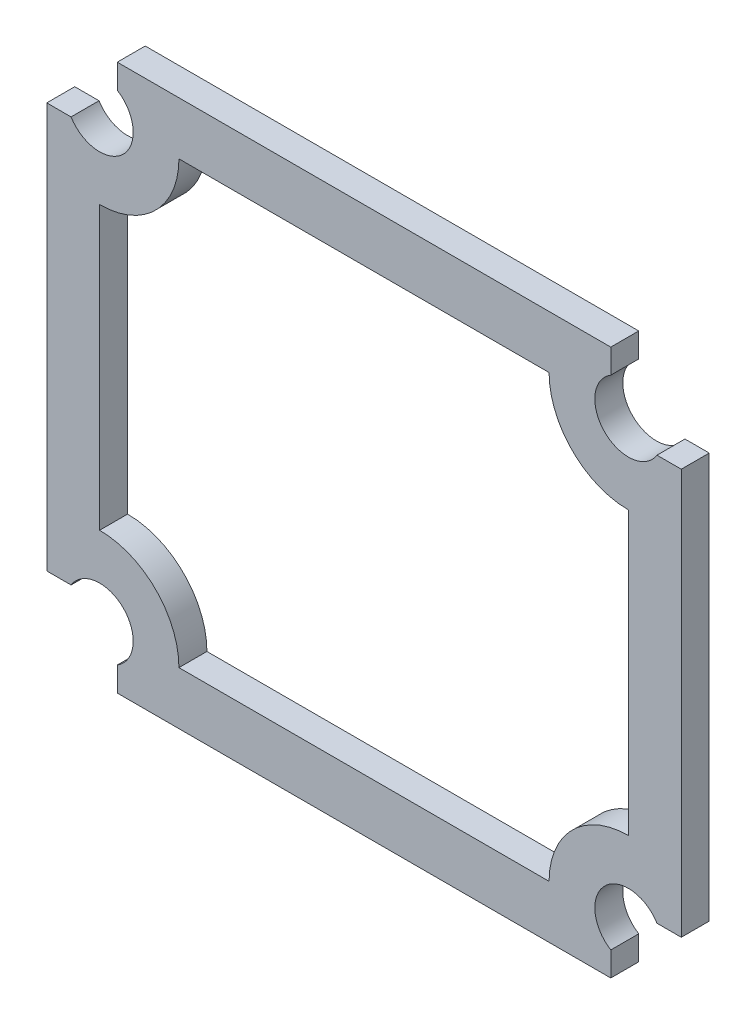
ISO-10303-21;
HEADER;
FILE_DESCRIPTION(('STEP AP214'),'2;1');
FILE_NAME('part.step','',(''),(''),'','','');
FILE_SCHEMA(('AUTOMOTIVE_DESIGN { 1 0 10303 214 1 1 1 1 }'));
ENDSEC;
DATA;
#1=APPLICATION_CONTEXT('core data for automotive mechanical design processes');
#2=APPLICATION_PROTOCOL_DEFINITION('international standard','automotive_design',2000,#1);
#3=PRODUCT_CONTEXT('',#1,'mechanical');
#4=PRODUCT('Part','Part','',(#3));
#5=PRODUCT_RELATED_PRODUCT_CATEGORY('part','',(#4));
#6=PRODUCT_DEFINITION_FORMATION('','',#4);
#7=PRODUCT_DEFINITION_CONTEXT('part definition',#1,'design');
#8=PRODUCT_DEFINITION('design','',#6,#7);
#9=PRODUCT_DEFINITION_SHAPE('','',#8);
#10=(LENGTH_UNIT() NAMED_UNIT(*) SI_UNIT(.MILLI.,.METRE.));
#11=(NAMED_UNIT(*) PLANE_ANGLE_UNIT() SI_UNIT($,.RADIAN.));
#12=(NAMED_UNIT(*) SI_UNIT($,.STERADIAN.) SOLID_ANGLE_UNIT());
#13=UNCERTAINTY_MEASURE_WITH_UNIT(LENGTH_MEASURE(1.E-05),#10,'distance_accuracy_value','');
#14=(GEOMETRIC_REPRESENTATION_CONTEXT(3) GLOBAL_UNCERTAINTY_ASSIGNED_CONTEXT((#13)) GLOBAL_UNIT_ASSIGNED_CONTEXT((#10,
#11,#12)) REPRESENTATION_CONTEXT('',''));
#15=CARTESIAN_POINT('',(0.,0.,0.));
#16=DIRECTION('',(0.,0.,1.));
#17=DIRECTION('',(1.,0.,0.));
#18=AXIS2_PLACEMENT_3D('',#15,#16,#17);
#19=CARTESIAN_POINT('',(-15.,-12.5,1.5875));
#20=DIRECTION('',(0.,0.,-1.));
#21=DIRECTION('',(-1.,0.,0.));
#22=AXIS2_PLACEMENT_3D('',#19,#20,#21);
#23=PLANE('',#22);
#24=DIRECTION('',(1.,0.,0.));
#25=VECTOR('',#24,1.);
#26=CARTESIAN_POINT('',(-18.,-11.5,1.5875));
#27=LINE('',#26,#25);
#28=CARTESIAN_POINT('',(-18.,-11.5,1.5875));
#29=VERTEX_POINT('',#28);
#30=CARTESIAN_POINT('',(-16.6214268407794,-11.5,1.5875));
#31=VERTEX_POINT('',#30);
#32=EDGE_CURVE('E290',#29,#31,#27,.T.);
#33=ORIENTED_EDGE('',*,*,#32,.T.);
#34=CARTESIAN_POINT('',(-15.,-12.5,1.5875));
#35=DIRECTION('',(0.,0.,-1.));
#36=DIRECTION('',(-1.,0.,0.));
#37=AXIS2_PLACEMENT_3D('',#34,#35,#36);
#38=CIRCLE('',#37,1.905);
#39=CARTESIAN_POINT('',(-14.,-14.1214268407794,1.5875));
#40=VERTEX_POINT('',#39);
#41=EDGE_CURVE('E294',#31,#40,#38,.T.);
#42=ORIENTED_EDGE('',*,*,#41,.T.);
#43=DIRECTION('',(0.,-1.,0.));
#44=VECTOR('',#43,1.);
#45=CARTESIAN_POINT('',(-14.,-15.5,1.5875));
#46=LINE('',#45,#44);
#47=CARTESIAN_POINT('',(-14.,-15.5,1.5875));
#48=VERTEX_POINT('',#47);
#49=EDGE_CURVE('E298',#40,#48,#46,.T.);
#50=ORIENTED_EDGE('',*,*,#49,.T.);
#51=DIRECTION('',(1.,0.,0.));
#52=VECTOR('',#51,1.);
#53=CARTESIAN_POINT('',(14.,-15.5,1.5875));
#54=LINE('',#53,#52);
#55=CARTESIAN_POINT('',(14.,-15.5,1.5875));
#56=VERTEX_POINT('',#55);
#57=EDGE_CURVE('E301',#48,#56,#54,.T.);
#58=ORIENTED_EDGE('',*,*,#57,.T.);
#59=DIRECTION('',(0.,1.,0.));
#60=VECTOR('',#59,1.);
#61=CARTESIAN_POINT('',(14.,-15.5,1.5875));
#62=LINE('',#61,#60);
#63=CARTESIAN_POINT('',(14.,-14.1214268407794,1.5875));
#64=VERTEX_POINT('',#63);
#65=EDGE_CURVE('E304',#56,#64,#62,.T.);
#66=ORIENTED_EDGE('',*,*,#65,.T.);
#67=CARTESIAN_POINT('',(15.,-12.5,1.5875));
#68=DIRECTION('',(0.,0.,-1.));
#69=DIRECTION('',(1.,0.,0.));
#70=AXIS2_PLACEMENT_3D('',#67,#68,#69);
#71=CIRCLE('',#70,1.905);
#72=CARTESIAN_POINT('',(16.6214268407794,-11.5,1.5875));
#73=VERTEX_POINT('',#72);
#74=EDGE_CURVE('E307',#64,#73,#71,.T.);
#75=ORIENTED_EDGE('',*,*,#74,.T.);
#76=DIRECTION('',(1.,0.,0.));
#77=VECTOR('',#76,1.);
#78=CARTESIAN_POINT('',(18.,-11.5,1.5875));
#79=LINE('',#78,#77);
#80=CARTESIAN_POINT('',(18.,-11.5,1.5875));
#81=VERTEX_POINT('',#80);
#82=EDGE_CURVE('E310',#73,#81,#79,.T.);
#83=ORIENTED_EDGE('',*,*,#82,.T.);
#84=DIRECTION('',(0.,1.,0.));
#85=VECTOR('',#84,1.);
#86=CARTESIAN_POINT('',(18.,11.5,1.5875));
#87=LINE('',#86,#85);
#88=CARTESIAN_POINT('',(18.,11.5,1.5875));
#89=VERTEX_POINT('',#88);
#90=EDGE_CURVE('E313',#81,#89,#87,.T.);
#91=ORIENTED_EDGE('',*,*,#90,.T.);
#92=DIRECTION('',(-1.,0.,0.));
#93=VECTOR('',#92,1.);
#94=CARTESIAN_POINT('',(18.,11.5,1.5875));
#95=LINE('',#94,#93);
#96=CARTESIAN_POINT('',(16.6214268407794,11.5,1.5875));
#97=VERTEX_POINT('',#96);
#98=EDGE_CURVE('E316',#89,#97,#95,.T.);
#99=ORIENTED_EDGE('',*,*,#98,.T.);
#100=CARTESIAN_POINT('',(15.,12.5,1.5875));
#101=DIRECTION('',(0.,0.,-1.));
#102=DIRECTION('',(-1.,0.,0.));
#103=AXIS2_PLACEMENT_3D('',#100,#101,#102);
#104=CIRCLE('',#103,1.905);
#105=CARTESIAN_POINT('',(14.,14.1214268407794,1.5875));
#106=VERTEX_POINT('',#105);
#107=EDGE_CURVE('E319',#97,#106,#104,.T.);
#108=ORIENTED_EDGE('',*,*,#107,.T.);
#109=DIRECTION('',(0.,1.,0.));
#110=VECTOR('',#109,1.);
#111=CARTESIAN_POINT('',(14.,15.5,1.5875));
#112=LINE('',#111,#110);
#113=CARTESIAN_POINT('',(14.,15.5,1.5875));
#114=VERTEX_POINT('',#113);
#115=EDGE_CURVE('E322',#106,#114,#112,.T.);
#116=ORIENTED_EDGE('',*,*,#115,.T.);
#117=DIRECTION('',(-1.,0.,0.));
#118=VECTOR('',#117,1.);
#119=CARTESIAN_POINT('',(14.,15.5,1.5875));
#120=LINE('',#119,#118);
#121=CARTESIAN_POINT('',(-14.,15.5,1.5875));
#122=VERTEX_POINT('',#121);
#123=EDGE_CURVE('E325',#114,#122,#120,.T.);
#124=ORIENTED_EDGE('',*,*,#123,.T.);
#125=DIRECTION('',(0.,-1.,0.));
#126=VECTOR('',#125,1.);
#127=CARTESIAN_POINT('',(-14.,15.5,1.5875));
#128=LINE('',#127,#126);
#129=CARTESIAN_POINT('',(-14.,14.1214268407794,1.5875));
#130=VERTEX_POINT('',#129);
#131=EDGE_CURVE('E328',#122,#130,#128,.T.);
#132=ORIENTED_EDGE('',*,*,#131,.T.);
#133=CARTESIAN_POINT('',(-15.,12.5,1.5875));
#134=DIRECTION('',(0.,0.,-1.));
#135=DIRECTION('',(1.,0.,0.));
#136=AXIS2_PLACEMENT_3D('',#133,#134,#135);
#137=CIRCLE('',#136,1.905);
#138=CARTESIAN_POINT('',(-16.6214268407794,11.5,1.5875));
#139=VERTEX_POINT('',#138);
#140=EDGE_CURVE('E331',#130,#139,#137,.T.);
#141=ORIENTED_EDGE('',*,*,#140,.T.);
#142=DIRECTION('',(-1.,0.,0.));
#143=VECTOR('',#142,1.);
#144=CARTESIAN_POINT('',(-18.,11.5,1.5875));
#145=LINE('',#144,#143);
#146=CARTESIAN_POINT('',(-18.,11.5,1.5875));
#147=VERTEX_POINT('',#146);
#148=EDGE_CURVE('E334',#139,#147,#145,.T.);
#149=ORIENTED_EDGE('',*,*,#148,.T.);
#150=DIRECTION('',(0.,-1.,0.));
#151=VECTOR('',#150,1.);
#152=CARTESIAN_POINT('',(-18.,11.5,1.5875));
#153=LINE('',#152,#151);
#154=EDGE_CURVE('E337',#147,#29,#153,.T.);
#155=ORIENTED_EDGE('',*,*,#154,.T.);
#156=EDGE_LOOP('',(#33,#42,#50,#58,#66,#75,#83,#91,#99,#108,#116,#124,#132,#141,#149,#155));
#157=FACE_BOUND('',#156,.T.);
#158=CARTESIAN_POINT('',(-15.,-12.5,1.5875));
#159=DIRECTION('',(0.,0.,-1.));
#160=DIRECTION('',(1.,0.,0.));
#161=AXIS2_PLACEMENT_3D('',#158,#159,#160);
#162=CIRCLE('',#161,4.5);
#163=CARTESIAN_POINT('',(-15.,-8.,1.5875));
#164=VERTEX_POINT('',#163);
#165=CARTESIAN_POINT('',(-10.5,-12.5,1.5875));
#166=VERTEX_POINT('',#165);
#167=EDGE_CURVE('E201',#164,#166,#162,.T.);
#168=ORIENTED_EDGE('',*,*,#167,.F.);
#169=DIRECTION('',(0.,-1.,0.));
#170=VECTOR('',#169,1.);
#171=CARTESIAN_POINT('',(-15.,7.99999999999999,1.5875));
#172=LINE('',#171,#170);
#173=CARTESIAN_POINT('',(-15.,7.99999999999999,1.5875));
#174=VERTEX_POINT('',#173);
#175=EDGE_CURVE('E242',#174,#164,#172,.T.);
#176=ORIENTED_EDGE('',*,*,#175,.F.);
#177=CARTESIAN_POINT('',(-15.,12.5,1.5875));
#178=DIRECTION('',(0.,0.,-1.));
#179=DIRECTION('',(-1.,0.,0.));
#180=AXIS2_PLACEMENT_3D('',#177,#178,#179);
#181=CIRCLE('',#180,4.5);
#182=CARTESIAN_POINT('',(-10.5,12.5,1.5875));
#183=VERTEX_POINT('',#182);
#184=EDGE_CURVE('E239',#183,#174,#181,.T.);
#185=ORIENTED_EDGE('',*,*,#184,.F.);
#186=DIRECTION('',(-1.,0.,0.));
#187=VECTOR('',#186,1.);
#188=CARTESIAN_POINT('',(10.5,12.5,1.5875));
#189=LINE('',#188,#187);
#190=CARTESIAN_POINT('',(10.5,12.5,1.5875));
#191=VERTEX_POINT('',#190);
#192=EDGE_CURVE('E236',#191,#183,#189,.T.);
#193=ORIENTED_EDGE('',*,*,#192,.F.);
#194=CARTESIAN_POINT('',(15.,12.5,1.5875));
#195=DIRECTION('',(0.,0.,-1.));
#196=DIRECTION('',(1.,0.,0.));
#197=AXIS2_PLACEMENT_3D('',#194,#195,#196);
#198=CIRCLE('',#197,4.5);
#199=CARTESIAN_POINT('',(15.,8.,1.5875));
#200=VERTEX_POINT('',#199);
#201=EDGE_CURVE('E233',#200,#191,#198,.T.);
#202=ORIENTED_EDGE('',*,*,#201,.F.);
#203=DIRECTION('',(0.,1.,0.));
#204=VECTOR('',#203,1.);
#205=CARTESIAN_POINT('',(15.,8.,1.5875));
#206=LINE('',#205,#204);
#207=CARTESIAN_POINT('',(15.,-8.00000000000001,1.5875));
#208=VERTEX_POINT('',#207);
#209=EDGE_CURVE('E228',#208,#200,#206,.T.);
#210=ORIENTED_EDGE('',*,*,#209,.F.);
#211=CARTESIAN_POINT('',(15.,-12.5,1.5875));
#212=DIRECTION('',(0.,0.,-1.));
#213=DIRECTION('',(-1.,0.,0.));
#214=AXIS2_PLACEMENT_3D('',#211,#212,#213);
#215=CIRCLE('',#214,4.5);
#216=CARTESIAN_POINT('',(10.5,-12.5,1.5875));
#217=VERTEX_POINT('',#216);
#218=EDGE_CURVE('E224',#217,#208,#215,.T.);
#219=ORIENTED_EDGE('',*,*,#218,.F.);
#220=DIRECTION('',(1.,0.,0.));
#221=VECTOR('',#220,1.);
#222=CARTESIAN_POINT('',(10.5,-12.5,1.5875));
#223=LINE('',#222,#221);
#224=EDGE_CURVE('E210',#166,#217,#223,.T.);
#225=ORIENTED_EDGE('',*,*,#224,.F.);
#226=EDGE_LOOP('',(#168,#176,#185,#193,#202,#210,#219,#225));
#227=FACE_BOUND('',#226,.T.);
#228=ADVANCED_FACE('F39',(#157,#227),#23,.F.);
#229=CARTESIAN_POINT('',(-15.,-12.5,0.));
#230=DIRECTION('',(0.,0.,-1.));
#231=DIRECTION('',(-1.,0.,0.));
#232=AXIS2_PLACEMENT_3D('',#229,#230,#231);
#233=PLANE('',#232);
#234=DIRECTION('',(1.,0.,0.));
#235=VECTOR('',#234,1.);
#236=CARTESIAN_POINT('',(-18.,-11.5,0.));
#237=LINE('',#236,#235);
#238=CARTESIAN_POINT('',(-18.,-11.5,0.));
#239=VERTEX_POINT('',#238);
#240=CARTESIAN_POINT('',(-16.6214268407794,-11.5,0.));
#241=VERTEX_POINT('',#240);
#242=EDGE_CURVE('E219',#239,#241,#237,.T.);
#243=ORIENTED_EDGE('',*,*,#242,.F.);
#244=DIRECTION('',(0.,-1.,0.));
#245=VECTOR('',#244,1.);
#246=CARTESIAN_POINT('',(-18.,11.5,0.));
#247=LINE('',#246,#245);
#248=CARTESIAN_POINT('',(-18.,11.5,0.));
#249=VERTEX_POINT('',#248);
#250=EDGE_CURVE('E295',#249,#239,#247,.T.);
#251=ORIENTED_EDGE('',*,*,#250,.F.);
#252=DIRECTION('',(-1.,0.,0.));
#253=VECTOR('',#252,1.);
#254=CARTESIAN_POINT('',(-18.,11.5,0.));
#255=LINE('',#254,#253);
#256=CARTESIAN_POINT('',(-16.6214268407794,11.5,0.));
#257=VERTEX_POINT('',#256);
#258=EDGE_CURVE('E383',#257,#249,#255,.T.);
#259=ORIENTED_EDGE('',*,*,#258,.F.);
#260=CARTESIAN_POINT('',(-15.,12.5,0.));
#261=DIRECTION('',(0.,0.,-1.));
#262=DIRECTION('',(1.,0.,0.));
#263=AXIS2_PLACEMENT_3D('',#260,#261,#262);
#264=CIRCLE('',#263,1.905);
#265=CARTESIAN_POINT('',(-14.,14.1214268407794,0.));
#266=VERTEX_POINT('',#265);
#267=EDGE_CURVE('E380',#266,#257,#264,.T.);
#268=ORIENTED_EDGE('',*,*,#267,.F.);
#269=DIRECTION('',(0.,-1.,0.));
#270=VECTOR('',#269,1.);
#271=CARTESIAN_POINT('',(-14.,15.5,0.));
#272=LINE('',#271,#270);
#273=CARTESIAN_POINT('',(-14.,15.5,0.));
#274=VERTEX_POINT('',#273);
#275=EDGE_CURVE('E377',#274,#266,#272,.T.);
#276=ORIENTED_EDGE('',*,*,#275,.F.);
#277=DIRECTION('',(-1.,0.,0.));
#278=VECTOR('',#277,1.);
#279=CARTESIAN_POINT('',(14.,15.5,0.));
#280=LINE('',#279,#278);
#281=CARTESIAN_POINT('',(14.,15.5,0.));
#282=VERTEX_POINT('',#281);
#283=EDGE_CURVE('E374',#282,#274,#280,.T.);
#284=ORIENTED_EDGE('',*,*,#283,.F.);
#285=DIRECTION('',(0.,1.,0.));
#286=VECTOR('',#285,1.);
#287=CARTESIAN_POINT('',(14.,15.5,0.));
#288=LINE('',#287,#286);
#289=CARTESIAN_POINT('',(14.,14.1214268407794,0.));
#290=VERTEX_POINT('',#289);
#291=EDGE_CURVE('E371',#290,#282,#288,.T.);
#292=ORIENTED_EDGE('',*,*,#291,.F.);
#293=CARTESIAN_POINT('',(15.,12.5,0.));
#294=DIRECTION('',(0.,0.,-1.));
#295=DIRECTION('',(-1.,0.,0.));
#296=AXIS2_PLACEMENT_3D('',#293,#294,#295);
#297=CIRCLE('',#296,1.905);
#298=CARTESIAN_POINT('',(16.6214268407794,11.5,0.));
#299=VERTEX_POINT('',#298);
#300=EDGE_CURVE('E368',#299,#290,#297,.T.);
#301=ORIENTED_EDGE('',*,*,#300,.F.);
#302=DIRECTION('',(-1.,0.,0.));
#303=VECTOR('',#302,1.);
#304=CARTESIAN_POINT('',(18.,11.5,0.));
#305=LINE('',#304,#303);
#306=CARTESIAN_POINT('',(18.,11.5,0.));
#307=VERTEX_POINT('',#306);
#308=EDGE_CURVE('E365',#307,#299,#305,.T.);
#309=ORIENTED_EDGE('',*,*,#308,.F.);
#310=DIRECTION('',(0.,1.,0.));
#311=VECTOR('',#310,1.);
#312=CARTESIAN_POINT('',(18.,11.5,0.));
#313=LINE('',#312,#311);
#314=CARTESIAN_POINT('',(18.,-11.5,0.));
#315=VERTEX_POINT('',#314);
#316=EDGE_CURVE('E362',#315,#307,#313,.T.);
#317=ORIENTED_EDGE('',*,*,#316,.F.);
#318=DIRECTION('',(1.,0.,0.));
#319=VECTOR('',#318,1.);
#320=CARTESIAN_POINT('',(18.,-11.5,0.));
#321=LINE('',#320,#319);
#322=CARTESIAN_POINT('',(16.6214268407794,-11.5,0.));
#323=VERTEX_POINT('',#322);
#324=EDGE_CURVE('E359',#323,#315,#321,.T.);
#325=ORIENTED_EDGE('',*,*,#324,.F.);
#326=CARTESIAN_POINT('',(15.,-12.5,0.));
#327=DIRECTION('',(0.,0.,-1.));
#328=DIRECTION('',(1.,0.,0.));
#329=AXIS2_PLACEMENT_3D('',#326,#327,#328);
#330=CIRCLE('',#329,1.905);
#331=CARTESIAN_POINT('',(14.,-14.1214268407794,0.));
#332=VERTEX_POINT('',#331);
#333=EDGE_CURVE('E356',#332,#323,#330,.T.);
#334=ORIENTED_EDGE('',*,*,#333,.F.);
#335=DIRECTION('',(0.,1.,0.));
#336=VECTOR('',#335,1.);
#337=CARTESIAN_POINT('',(14.,-15.5,0.));
#338=LINE('',#337,#336);
#339=CARTESIAN_POINT('',(14.,-15.5,0.));
#340=VERTEX_POINT('',#339);
#341=EDGE_CURVE('E353',#340,#332,#338,.T.);
#342=ORIENTED_EDGE('',*,*,#341,.F.);
#343=DIRECTION('',(1.,0.,0.));
#344=VECTOR('',#343,1.);
#345=CARTESIAN_POINT('',(14.,-15.5,0.));
#346=LINE('',#345,#344);
#347=CARTESIAN_POINT('',(-14.,-15.5,0.));
#348=VERTEX_POINT('',#347);
#349=EDGE_CURVE('E350',#348,#340,#346,.T.);
#350=ORIENTED_EDGE('',*,*,#349,.F.);
#351=DIRECTION('',(0.,-1.,0.));
#352=VECTOR('',#351,1.);
#353=CARTESIAN_POINT('',(-14.,-15.5,0.));
#354=LINE('',#353,#352);
#355=CARTESIAN_POINT('',(-14.,-14.1214268407794,0.));
#356=VERTEX_POINT('',#355);
#357=EDGE_CURVE('E347',#356,#348,#354,.T.);
#358=ORIENTED_EDGE('',*,*,#357,.F.);
#359=CARTESIAN_POINT('',(-15.,-12.5,0.));
#360=DIRECTION('',(0.,0.,-1.));
#361=DIRECTION('',(-1.,0.,0.));
#362=AXIS2_PLACEMENT_3D('',#359,#360,#361);
#363=CIRCLE('',#362,1.905);
#364=EDGE_CURVE('E344',#241,#356,#363,.T.);
#365=ORIENTED_EDGE('',*,*,#364,.F.);
#366=EDGE_LOOP('',(#243,#251,#259,#268,#276,#284,#292,#301,#309,#317,#325,#334,#342,#350,#358,#365));
#367=FACE_BOUND('',#366,.T.);
#368=DIRECTION('',(0.,-1.,0.));
#369=VECTOR('',#368,1.);
#370=CARTESIAN_POINT('',(-15.,7.99999999999999,0.));
#371=LINE('',#370,#369);
#372=CARTESIAN_POINT('',(-15.,8.,0.));
#373=VERTEX_POINT('',#372);
#374=CARTESIAN_POINT('',(-15.,-8.,0.));
#375=VERTEX_POINT('',#374);
#376=EDGE_CURVE('E211',#373,#375,#371,.T.);
#377=ORIENTED_EDGE('',*,*,#376,.T.);
#378=CARTESIAN_POINT('',(-15.,-12.5,0.));
#379=DIRECTION('',(0.,0.,-1.));
#380=DIRECTION('',(1.,0.,0.));
#381=AXIS2_PLACEMENT_3D('',#378,#379,#380);
#382=CIRCLE('',#381,4.5);
#383=CARTESIAN_POINT('',(-10.5,-12.5,0.));
#384=VERTEX_POINT('',#383);
#385=EDGE_CURVE('E63',#375,#384,#382,.T.);
#386=ORIENTED_EDGE('',*,*,#385,.T.);
#387=DIRECTION('',(1.,0.,0.));
#388=VECTOR('',#387,1.);
#389=CARTESIAN_POINT('',(10.5,-12.5,0.));
#390=LINE('',#389,#388);
#391=CARTESIAN_POINT('',(10.5,-12.5,0.));
#392=VERTEX_POINT('',#391);
#393=EDGE_CURVE('E217',#384,#392,#390,.T.);
#394=ORIENTED_EDGE('',*,*,#393,.T.);
#395=CARTESIAN_POINT('',(15.,-12.5,0.));
#396=DIRECTION('',(0.,0.,-1.));
#397=DIRECTION('',(-1.,0.,0.));
#398=AXIS2_PLACEMENT_3D('',#395,#396,#397);
#399=CIRCLE('',#398,4.5);
#400=CARTESIAN_POINT('',(15.,-8.00000000000001,0.));
#401=VERTEX_POINT('',#400);
#402=EDGE_CURVE('E249',#392,#401,#399,.T.);
#403=ORIENTED_EDGE('',*,*,#402,.T.);
#404=DIRECTION('',(0.,1.,0.));
#405=VECTOR('',#404,1.);
#406=CARTESIAN_POINT('',(15.,8.,0.));
#407=LINE('',#406,#405);
#408=CARTESIAN_POINT('',(15.,8.,0.));
#409=VERTEX_POINT('',#408);
#410=EDGE_CURVE('E253',#401,#409,#407,.T.);
#411=ORIENTED_EDGE('',*,*,#410,.T.);
#412=CARTESIAN_POINT('',(15.,12.5,0.));
#413=DIRECTION('',(0.,0.,-1.));
#414=DIRECTION('',(1.,0.,0.));
#415=AXIS2_PLACEMENT_3D('',#412,#413,#414);
#416=CIRCLE('',#415,4.5);
#417=CARTESIAN_POINT('',(10.5,12.5,0.));
#418=VERTEX_POINT('',#417);
#419=EDGE_CURVE('E257',#409,#418,#416,.T.);
#420=ORIENTED_EDGE('',*,*,#419,.T.);
#421=DIRECTION('',(-1.,0.,0.));
#422=VECTOR('',#421,1.);
#423=CARTESIAN_POINT('',(10.5,12.5,0.));
#424=LINE('',#423,#422);
#425=CARTESIAN_POINT('',(-10.5,12.5,0.));
#426=VERTEX_POINT('',#425);
#427=EDGE_CURVE('E261',#418,#426,#424,.T.);
#428=ORIENTED_EDGE('',*,*,#427,.T.);
#429=CARTESIAN_POINT('',(-15.,12.5,0.));
#430=DIRECTION('',(0.,0.,-1.));
#431=DIRECTION('',(-1.,0.,0.));
#432=AXIS2_PLACEMENT_3D('',#429,#430,#431);
#433=CIRCLE('',#432,4.5);
#434=EDGE_CURVE('E265',#426,#373,#433,.T.);
#435=ORIENTED_EDGE('',*,*,#434,.T.);
#436=EDGE_LOOP('',(#377,#386,#394,#403,#411,#420,#428,#435));
#437=FACE_BOUND('',#436,.T.);
#438=ADVANCED_FACE('F454',(#367,#437),#233,.T.);
#439=CARTESIAN_POINT('',(-18.,-11.5,1.5875));
#440=DIRECTION('',(0.,1.,0.));
#441=DIRECTION('',(0.,0.,1.));
#442=AXIS2_PLACEMENT_3D('',#439,#440,#441);
#443=PLANE('',#442);
#444=ORIENTED_EDGE('',*,*,#242,.T.);
#445=DIRECTION('',(0.,0.,-1.));
#446=VECTOR('',#445,1.);
#447=CARTESIAN_POINT('',(-16.6214268407794,-11.5,1.5875));
#448=LINE('',#447,#446);
#449=EDGE_CURVE('E11',#31,#241,#448,.T.);
#450=ORIENTED_EDGE('',*,*,#449,.F.);
#451=ORIENTED_EDGE('',*,*,#32,.F.);
#452=DIRECTION('',(0.,0.,-1.));
#453=VECTOR('',#452,1.);
#454=CARTESIAN_POINT('',(-18.,-11.5,1.5875));
#455=LINE('',#454,#453);
#456=EDGE_CURVE('E340',#29,#239,#455,.T.);
#457=ORIENTED_EDGE('',*,*,#456,.T.);
#458=EDGE_LOOP('',(#444,#450,#451,#457));
#459=FACE_BOUND('',#458,.T.);
#460=ADVANCED_FACE('F41',(#459),#443,.F.);
#461=CARTESIAN_POINT('',(-15.,-12.5,1.5875));
#462=DIRECTION('',(0.,0.,-1.));
#463=DIRECTION('',(-1.,0.,0.));
#464=AXIS2_PLACEMENT_3D('',#461,#462,#463);
#465=CYLINDRICAL_SURFACE('',#464,1.905);
#466=ORIENTED_EDGE('',*,*,#364,.T.);
#467=DIRECTION('',(0.,0.,-1.));
#468=VECTOR('',#467,1.);
#469=CARTESIAN_POINT('',(-14.,-14.1214268407794,1.5875));
#470=LINE('',#469,#468);
#471=EDGE_CURVE('E48',#40,#356,#470,.T.);
#472=ORIENTED_EDGE('',*,*,#471,.F.);
#473=ORIENTED_EDGE('',*,*,#41,.F.);
#474=ORIENTED_EDGE('',*,*,#449,.T.);
#475=EDGE_LOOP('',(#466,#472,#473,#474));
#476=FACE_BOUND('',#475,.T.);
#477=ADVANCED_FACE('F471',(#476),#465,.F.);
#478=CARTESIAN_POINT('',(-14.,-15.5,1.5875));
#479=DIRECTION('',(1.,0.,0.));
#480=DIRECTION('',(0.,0.,-1.));
#481=AXIS2_PLACEMENT_3D('',#478,#479,#480);
#482=PLANE('',#481);
#483=ORIENTED_EDGE('',*,*,#357,.T.);
#484=DIRECTION('',(0.,0.,-1.));
#485=VECTOR('',#484,1.);
#486=CARTESIAN_POINT('',(-14.,-15.5,1.5875));
#487=LINE('',#486,#485);
#488=EDGE_CURVE('E439',#48,#348,#487,.T.);
#489=ORIENTED_EDGE('',*,*,#488,.F.);
#490=ORIENTED_EDGE('',*,*,#49,.F.);
#491=ORIENTED_EDGE('',*,*,#471,.T.);
#492=EDGE_LOOP('',(#483,#489,#490,#491));
#493=FACE_BOUND('',#492,.T.);
#494=ADVANCED_FACE('F448',(#493),#482,.F.);
#495=CARTESIAN_POINT('',(14.,-15.5,1.5875));
#496=DIRECTION('',(0.,1.,0.));
#497=DIRECTION('',(0.,0.,1.));
#498=AXIS2_PLACEMENT_3D('',#495,#496,#497);
#499=PLANE('',#498);
#500=ORIENTED_EDGE('',*,*,#349,.T.);
#501=DIRECTION('',(0.,0.,-1.));
#502=VECTOR('',#501,1.);
#503=CARTESIAN_POINT('',(14.,-15.5,1.5875));
#504=LINE('',#503,#502);
#505=EDGE_CURVE('E435',#56,#340,#504,.T.);
#506=ORIENTED_EDGE('',*,*,#505,.F.);
#507=ORIENTED_EDGE('',*,*,#57,.F.);
#508=ORIENTED_EDGE('',*,*,#488,.T.);
#509=EDGE_LOOP('',(#500,#506,#507,#508));
#510=FACE_BOUND('',#509,.T.);
#511=ADVANCED_FACE('F460',(#510),#499,.F.);
#512=CARTESIAN_POINT('',(14.,-15.5,1.5875));
#513=DIRECTION('',(-1.,0.,0.));
#514=DIRECTION('',(0.,-1.,0.));
#515=AXIS2_PLACEMENT_3D('',#512,#513,#514);
#516=PLANE('',#515);
#517=ORIENTED_EDGE('',*,*,#341,.T.);
#518=DIRECTION('',(0.,0.,-1.));
#519=VECTOR('',#518,1.);
#520=CARTESIAN_POINT('',(14.,-14.1214268407794,1.5875));
#521=LINE('',#520,#519);
#522=EDGE_CURVE('E431',#64,#332,#521,.T.);
#523=ORIENTED_EDGE('',*,*,#522,.F.);
#524=ORIENTED_EDGE('',*,*,#65,.F.);
#525=ORIENTED_EDGE('',*,*,#505,.T.);
#526=EDGE_LOOP('',(#517,#523,#524,#525));
#527=FACE_BOUND('',#526,.T.);
#528=ADVANCED_FACE('F464',(#527),#516,.F.);
#529=CARTESIAN_POINT('',(15.,-12.5,1.5875));
#530=DIRECTION('',(0.,0.,-1.));
#531=DIRECTION('',(-1.,0.,0.));
#532=AXIS2_PLACEMENT_3D('',#529,#530,#531);
#533=CYLINDRICAL_SURFACE('',#532,1.905);
#534=ORIENTED_EDGE('',*,*,#333,.T.);
#535=DIRECTION('',(0.,0.,-1.));
#536=VECTOR('',#535,1.);
#537=CARTESIAN_POINT('',(16.6214268407794,-11.5,1.5875));
#538=LINE('',#537,#536);
#539=EDGE_CURVE('E427',#73,#323,#538,.T.);
#540=ORIENTED_EDGE('',*,*,#539,.F.);
#541=ORIENTED_EDGE('',*,*,#74,.F.);
#542=ORIENTED_EDGE('',*,*,#522,.T.);
#543=EDGE_LOOP('',(#534,#540,#541,#542));
#544=FACE_BOUND('',#543,.T.);
#545=ADVANCED_FACE('F524',(#544),#533,.F.);
#546=CARTESIAN_POINT('',(18.,-11.5,1.5875));
#547=DIRECTION('',(0.,1.,0.));
#548=DIRECTION('',(-1.,0.,0.));
#549=AXIS2_PLACEMENT_3D('',#546,#547,#548);
#550=PLANE('',#549);
#551=ORIENTED_EDGE('',*,*,#324,.T.);
#552=DIRECTION('',(0.,0.,-1.));
#553=VECTOR('',#552,1.);
#554=CARTESIAN_POINT('',(18.,-11.5,1.5875));
#555=LINE('',#554,#553);
#556=EDGE_CURVE('E423',#81,#315,#555,.T.);
#557=ORIENTED_EDGE('',*,*,#556,.F.);
#558=ORIENTED_EDGE('',*,*,#82,.F.);
#559=ORIENTED_EDGE('',*,*,#539,.T.);
#560=EDGE_LOOP('',(#551,#557,#558,#559));
#561=FACE_BOUND('',#560,.T.);
#562=ADVANCED_FACE('F521',(#561),#550,.F.);
#563=CARTESIAN_POINT('',(18.,11.5,1.5875));
#564=DIRECTION('',(-1.,0.,0.));
#565=DIRECTION('',(0.,0.,1.));
#566=AXIS2_PLACEMENT_3D('',#563,#564,#565);
#567=PLANE('',#566);
#568=ORIENTED_EDGE('',*,*,#316,.T.);
#569=DIRECTION('',(0.,0.,-1.));
#570=VECTOR('',#569,1.);
#571=CARTESIAN_POINT('',(18.,11.5,1.5875));
#572=LINE('',#571,#570);
#573=EDGE_CURVE('E419',#89,#307,#572,.T.);
#574=ORIENTED_EDGE('',*,*,#573,.F.);
#575=ORIENTED_EDGE('',*,*,#90,.F.);
#576=ORIENTED_EDGE('',*,*,#556,.T.);
#577=EDGE_LOOP('',(#568,#574,#575,#576));
#578=FACE_BOUND('',#577,.T.);
#579=ADVANCED_FACE('F517',(#578),#567,.F.);
#580=CARTESIAN_POINT('',(18.,11.5,1.5875));
#581=DIRECTION('',(0.,-1.,0.));
#582=DIRECTION('',(0.,0.,-1.));
#583=AXIS2_PLACEMENT_3D('',#580,#581,#582);
#584=PLANE('',#583);
#585=ORIENTED_EDGE('',*,*,#308,.T.);
#586=DIRECTION('',(0.,0.,-1.));
#587=VECTOR('',#586,1.);
#588=CARTESIAN_POINT('',(16.6214268407794,11.5,1.5875));
#589=LINE('',#588,#587);
#590=EDGE_CURVE('E415',#97,#299,#589,.T.);
#591=ORIENTED_EDGE('',*,*,#590,.F.);
#592=ORIENTED_EDGE('',*,*,#98,.F.);
#593=ORIENTED_EDGE('',*,*,#573,.T.);
#594=EDGE_LOOP('',(#585,#591,#592,#593));
#595=FACE_BOUND('',#594,.T.);
#596=ADVANCED_FACE('F513',(#595),#584,.F.);
#597=CARTESIAN_POINT('',(15.,12.5,1.5875));
#598=DIRECTION('',(0.,0.,-1.));
#599=DIRECTION('',(-1.,0.,0.));
#600=AXIS2_PLACEMENT_3D('',#597,#598,#599);
#601=CYLINDRICAL_SURFACE('',#600,1.905);
#602=ORIENTED_EDGE('',*,*,#300,.T.);
#603=DIRECTION('',(0.,0.,-1.));
#604=VECTOR('',#603,1.);
#605=CARTESIAN_POINT('',(14.,14.1214268407794,1.5875));
#606=LINE('',#605,#604);
#607=EDGE_CURVE('E411',#106,#290,#606,.T.);
#608=ORIENTED_EDGE('',*,*,#607,.F.);
#609=ORIENTED_EDGE('',*,*,#107,.F.);
#610=ORIENTED_EDGE('',*,*,#590,.T.);
#611=EDGE_LOOP('',(#602,#608,#609,#610));
#612=FACE_BOUND('',#611,.T.);
#613=ADVANCED_FACE('F508',(#612),#601,.F.);
#614=CARTESIAN_POINT('',(14.,15.5,1.5875));
#615=DIRECTION('',(-1.,0.,0.));
#616=DIRECTION('',(0.,-1.,0.));
#617=AXIS2_PLACEMENT_3D('',#614,#615,#616);
#618=PLANE('',#617);
#619=ORIENTED_EDGE('',*,*,#291,.T.);
#620=DIRECTION('',(0.,0.,-1.));
#621=VECTOR('',#620,1.);
#622=CARTESIAN_POINT('',(14.,15.5,1.5875));
#623=LINE('',#622,#621);
#624=EDGE_CURVE('E407',#114,#282,#623,.T.);
#625=ORIENTED_EDGE('',*,*,#624,.F.);
#626=ORIENTED_EDGE('',*,*,#115,.F.);
#627=ORIENTED_EDGE('',*,*,#607,.T.);
#628=EDGE_LOOP('',(#619,#625,#626,#627));
#629=FACE_BOUND('',#628,.T.);
#630=ADVANCED_FACE('F502',(#629),#618,.F.);
#631=CARTESIAN_POINT('',(14.,15.5,1.5875));
#632=DIRECTION('',(0.,-1.,0.));
#633=DIRECTION('',(0.,0.,-1.));
#634=AXIS2_PLACEMENT_3D('',#631,#632,#633);
#635=PLANE('',#634);
#636=ORIENTED_EDGE('',*,*,#283,.T.);
#637=DIRECTION('',(0.,0.,-1.));
#638=VECTOR('',#637,1.);
#639=CARTESIAN_POINT('',(-14.,15.5,1.5875));
#640=LINE('',#639,#638);
#641=EDGE_CURVE('E403',#122,#274,#640,.T.);
#642=ORIENTED_EDGE('',*,*,#641,.F.);
#643=ORIENTED_EDGE('',*,*,#123,.F.);
#644=ORIENTED_EDGE('',*,*,#624,.T.);
#645=EDGE_LOOP('',(#636,#642,#643,#644));
#646=FACE_BOUND('',#645,.T.);
#647=ADVANCED_FACE('F498',(#646),#635,.F.);
#648=CARTESIAN_POINT('',(-14.,15.5,1.5875));
#649=DIRECTION('',(1.,0.,0.));
#650=DIRECTION('',(0.,1.,0.));
#651=AXIS2_PLACEMENT_3D('',#648,#649,#650);
#652=PLANE('',#651);
#653=ORIENTED_EDGE('',*,*,#275,.T.);
#654=DIRECTION('',(0.,0.,-1.));
#655=VECTOR('',#654,1.);
#656=CARTESIAN_POINT('',(-14.,14.1214268407794,1.5875));
#657=LINE('',#656,#655);
#658=EDGE_CURVE('E399',#130,#266,#657,.T.);
#659=ORIENTED_EDGE('',*,*,#658,.F.);
#660=ORIENTED_EDGE('',*,*,#131,.F.);
#661=ORIENTED_EDGE('',*,*,#641,.T.);
#662=EDGE_LOOP('',(#653,#659,#660,#661));
#663=FACE_BOUND('',#662,.T.);
#664=ADVANCED_FACE('F493',(#663),#652,.F.);
#665=CARTESIAN_POINT('',(-15.,12.5,1.5875));
#666=DIRECTION('',(0.,0.,-1.));
#667=DIRECTION('',(-1.,0.,0.));
#668=AXIS2_PLACEMENT_3D('',#665,#666,#667);
#669=CYLINDRICAL_SURFACE('',#668,1.905);
#670=ORIENTED_EDGE('',*,*,#267,.T.);
#671=DIRECTION('',(0.,0.,-1.));
#672=VECTOR('',#671,1.);
#673=CARTESIAN_POINT('',(-16.6214268407794,11.5,1.5875));
#674=LINE('',#673,#672);
#675=EDGE_CURVE('E395',#139,#257,#674,.T.);
#676=ORIENTED_EDGE('',*,*,#675,.F.);
#677=ORIENTED_EDGE('',*,*,#140,.F.);
#678=ORIENTED_EDGE('',*,*,#658,.T.);
#679=EDGE_LOOP('',(#670,#676,#677,#678));
#680=FACE_BOUND('',#679,.T.);
#681=ADVANCED_FACE('F487',(#680),#669,.F.);
#682=CARTESIAN_POINT('',(-18.,11.5,1.5875));
#683=DIRECTION('',(0.,-1.,0.));
#684=DIRECTION('',(1.,0.,0.));
#685=AXIS2_PLACEMENT_3D('',#682,#683,#684);
#686=PLANE('',#685);
#687=ORIENTED_EDGE('',*,*,#258,.T.);
#688=DIRECTION('',(0.,0.,-1.));
#689=VECTOR('',#688,1.);
#690=CARTESIAN_POINT('',(-18.,11.5,1.5875));
#691=LINE('',#690,#689);
#692=EDGE_CURVE('E391',#147,#249,#691,.T.);
#693=ORIENTED_EDGE('',*,*,#692,.F.);
#694=ORIENTED_EDGE('',*,*,#148,.F.);
#695=ORIENTED_EDGE('',*,*,#675,.T.);
#696=EDGE_LOOP('',(#687,#693,#694,#695));
#697=FACE_BOUND('',#696,.T.);
#698=ADVANCED_FACE('F483',(#697),#686,.F.);
#699=CARTESIAN_POINT('',(-18.,11.5,1.5875));
#700=DIRECTION('',(1.,0.,0.));
#701=DIRECTION('',(0.,0.,-1.));
#702=AXIS2_PLACEMENT_3D('',#699,#700,#701);
#703=PLANE('',#702);
#704=ORIENTED_EDGE('',*,*,#250,.T.);
#705=ORIENTED_EDGE('',*,*,#456,.F.);
#706=ORIENTED_EDGE('',*,*,#154,.F.);
#707=ORIENTED_EDGE('',*,*,#692,.T.);
#708=EDGE_LOOP('',(#704,#705,#706,#707));
#709=FACE_BOUND('',#708,.T.);
#710=ADVANCED_FACE('F478',(#709),#703,.F.);
#711=CARTESIAN_POINT('',(-15.,-12.5,1.5875));
#712=DIRECTION('',(0.,0.,-1.));
#713=DIRECTION('',(-1.,0.,0.));
#714=AXIS2_PLACEMENT_3D('',#711,#712,#713);
#715=CYLINDRICAL_SURFACE('',#714,4.5);
#716=ORIENTED_EDGE('',*,*,#385,.F.);
#717=DIRECTION('',(0.,0.,-1.));
#718=VECTOR('',#717,1.);
#719=CARTESIAN_POINT('',(-15.,-8.,1.5875));
#720=LINE('',#719,#718);
#721=EDGE_CURVE('E205',#164,#375,#720,.T.);
#722=ORIENTED_EDGE('',*,*,#721,.F.);
#723=ORIENTED_EDGE('',*,*,#167,.T.);
#724=DIRECTION('',(0.,0.,-1.));
#725=VECTOR('',#724,1.);
#726=CARTESIAN_POINT('',(-10.5,-12.5,1.5875));
#727=LINE('',#726,#725);
#728=EDGE_CURVE('E204',#166,#384,#727,.T.);
#729=ORIENTED_EDGE('',*,*,#728,.T.);
#730=EDGE_LOOP('',(#716,#722,#723,#729));
#731=FACE_BOUND('',#730,.T.);
#732=ADVANCED_FACE('F203',(#731),#715,.T.);
#733=CARTESIAN_POINT('',(10.5,-12.5,1.5875));
#734=DIRECTION('',(0.,1.,0.));
#735=DIRECTION('',(-1.,0.,0.));
#736=AXIS2_PLACEMENT_3D('',#733,#734,#735);
#737=PLANE('',#736);
#738=ORIENTED_EDGE('',*,*,#393,.F.);
#739=ORIENTED_EDGE('',*,*,#728,.F.);
#740=ORIENTED_EDGE('',*,*,#224,.T.);
#741=DIRECTION('',(0.,0.,-1.));
#742=VECTOR('',#741,1.);
#743=CARTESIAN_POINT('',(10.5,-12.5,1.5875));
#744=LINE('',#743,#742);
#745=EDGE_CURVE('E220',#217,#392,#744,.T.);
#746=ORIENTED_EDGE('',*,*,#745,.T.);
#747=EDGE_LOOP('',(#738,#739,#740,#746));
#748=FACE_BOUND('',#747,.T.);
#749=ADVANCED_FACE('F214',(#748),#737,.T.);
#750=CARTESIAN_POINT('',(15.,-12.5,1.5875));
#751=DIRECTION('',(0.,0.,-1.));
#752=DIRECTION('',(-1.,0.,0.));
#753=AXIS2_PLACEMENT_3D('',#750,#751,#752);
#754=CYLINDRICAL_SURFACE('',#753,4.5);
#755=ORIENTED_EDGE('',*,*,#402,.F.);
#756=ORIENTED_EDGE('',*,*,#745,.F.);
#757=ORIENTED_EDGE('',*,*,#218,.T.);
#758=DIRECTION('',(0.,0.,-1.));
#759=VECTOR('',#758,1.);
#760=CARTESIAN_POINT('',(15.,-8.00000000000001,1.5875));
#761=LINE('',#760,#759);
#762=EDGE_CURVE('E285',#208,#401,#761,.T.);
#763=ORIENTED_EDGE('',*,*,#762,.T.);
#764=EDGE_LOOP('',(#755,#756,#757,#763));
#765=FACE_BOUND('',#764,.T.);
#766=ADVANCED_FACE('F606',(#765),#754,.T.);
#767=CARTESIAN_POINT('',(15.,8.,1.5875));
#768=DIRECTION('',(-1.,0.,0.));
#769=DIRECTION('',(0.,-1.,0.));
#770=AXIS2_PLACEMENT_3D('',#767,#768,#769);
#771=PLANE('',#770);
#772=ORIENTED_EDGE('',*,*,#410,.F.);
#773=ORIENTED_EDGE('',*,*,#762,.F.);
#774=ORIENTED_EDGE('',*,*,#209,.T.);
#775=DIRECTION('',(0.,0.,-1.));
#776=VECTOR('',#775,1.);
#777=CARTESIAN_POINT('',(15.,8.,1.5875));
#778=LINE('',#777,#776);
#779=EDGE_CURVE('E282',#200,#409,#778,.T.);
#780=ORIENTED_EDGE('',*,*,#779,.T.);
#781=EDGE_LOOP('',(#772,#773,#774,#780));
#782=FACE_BOUND('',#781,.T.);
#783=ADVANCED_FACE('F612',(#782),#771,.T.);
#784=CARTESIAN_POINT('',(15.,12.5,1.5875));
#785=DIRECTION('',(0.,0.,-1.));
#786=DIRECTION('',(-1.,0.,0.));
#787=AXIS2_PLACEMENT_3D('',#784,#785,#786);
#788=CYLINDRICAL_SURFACE('',#787,4.5);
#789=ORIENTED_EDGE('',*,*,#419,.F.);
#790=ORIENTED_EDGE('',*,*,#779,.F.);
#791=ORIENTED_EDGE('',*,*,#201,.T.);
#792=DIRECTION('',(0.,0.,-1.));
#793=VECTOR('',#792,1.);
#794=CARTESIAN_POINT('',(10.5,12.5,1.5875));
#795=LINE('',#794,#793);
#796=EDGE_CURVE('E279',#191,#418,#795,.T.);
#797=ORIENTED_EDGE('',*,*,#796,.T.);
#798=EDGE_LOOP('',(#789,#790,#791,#797));
#799=FACE_BOUND('',#798,.T.);
#800=ADVANCED_FACE('F620',(#799),#788,.T.);
#801=CARTESIAN_POINT('',(10.5,12.5,1.5875));
#802=DIRECTION('',(0.,-1.,0.));
#803=DIRECTION('',(1.,0.,0.));
#804=AXIS2_PLACEMENT_3D('',#801,#802,#803);
#805=PLANE('',#804);
#806=ORIENTED_EDGE('',*,*,#427,.F.);
#807=ORIENTED_EDGE('',*,*,#796,.F.);
#808=ORIENTED_EDGE('',*,*,#192,.T.);
#809=DIRECTION('',(0.,0.,-1.));
#810=VECTOR('',#809,1.);
#811=CARTESIAN_POINT('',(-10.5,12.5,1.5875));
#812=LINE('',#811,#810);
#813=EDGE_CURVE('E276',#183,#426,#812,.T.);
#814=ORIENTED_EDGE('',*,*,#813,.T.);
#815=EDGE_LOOP('',(#806,#807,#808,#814));
#816=FACE_BOUND('',#815,.T.);
#817=ADVANCED_FACE('F628',(#816),#805,.T.);
#818=CARTESIAN_POINT('',(-15.,12.5,1.5875));
#819=DIRECTION('',(0.,0.,-1.));
#820=DIRECTION('',(-1.,0.,0.));
#821=AXIS2_PLACEMENT_3D('',#818,#819,#820);
#822=CYLINDRICAL_SURFACE('',#821,4.5);
#823=ORIENTED_EDGE('',*,*,#434,.F.);
#824=ORIENTED_EDGE('',*,*,#813,.F.);
#825=ORIENTED_EDGE('',*,*,#184,.T.);
#826=DIRECTION('',(0.,0.,-1.));
#827=VECTOR('',#826,1.);
#828=CARTESIAN_POINT('',(-15.,8.,1.5875));
#829=LINE('',#828,#827);
#830=EDGE_CURVE('E55',#174,#373,#829,.T.);
#831=ORIENTED_EDGE('',*,*,#830,.T.);
#832=EDGE_LOOP('',(#823,#824,#825,#831));
#833=FACE_BOUND('',#832,.T.);
#834=ADVANCED_FACE('F636',(#833),#822,.T.);
#835=CARTESIAN_POINT('',(-15.,7.99999999999999,1.5875));
#836=DIRECTION('',(1.,0.,0.));
#837=DIRECTION('',(0.,1.,0.));
#838=AXIS2_PLACEMENT_3D('',#835,#836,#837);
#839=PLANE('',#838);
#840=ORIENTED_EDGE('',*,*,#376,.F.);
#841=ORIENTED_EDGE('',*,*,#830,.F.);
#842=ORIENTED_EDGE('',*,*,#175,.T.);
#843=ORIENTED_EDGE('',*,*,#721,.T.);
#844=EDGE_LOOP('',(#840,#841,#842,#843));
#845=FACE_BOUND('',#844,.T.);
#846=ADVANCED_FACE('F644',(#845),#839,.T.);
#847=CLOSED_SHELL('',(#228,#438,#460,#477,#494,#511,#528,#545,#562,#579,#596,#613,#630,#647,
#664,#681,#698,#710,#732,#749,#766,#783,#800,#817,#834,#846));
#848=MANIFOLD_SOLID_BREP('B2',#847);
#849=ADVANCED_BREP_SHAPE_REPRESENTATION('',(#18,#848),#14);
#850=SHAPE_DEFINITION_REPRESENTATION(#9,#849);
ENDSEC;
END-ISO-10303-21;
